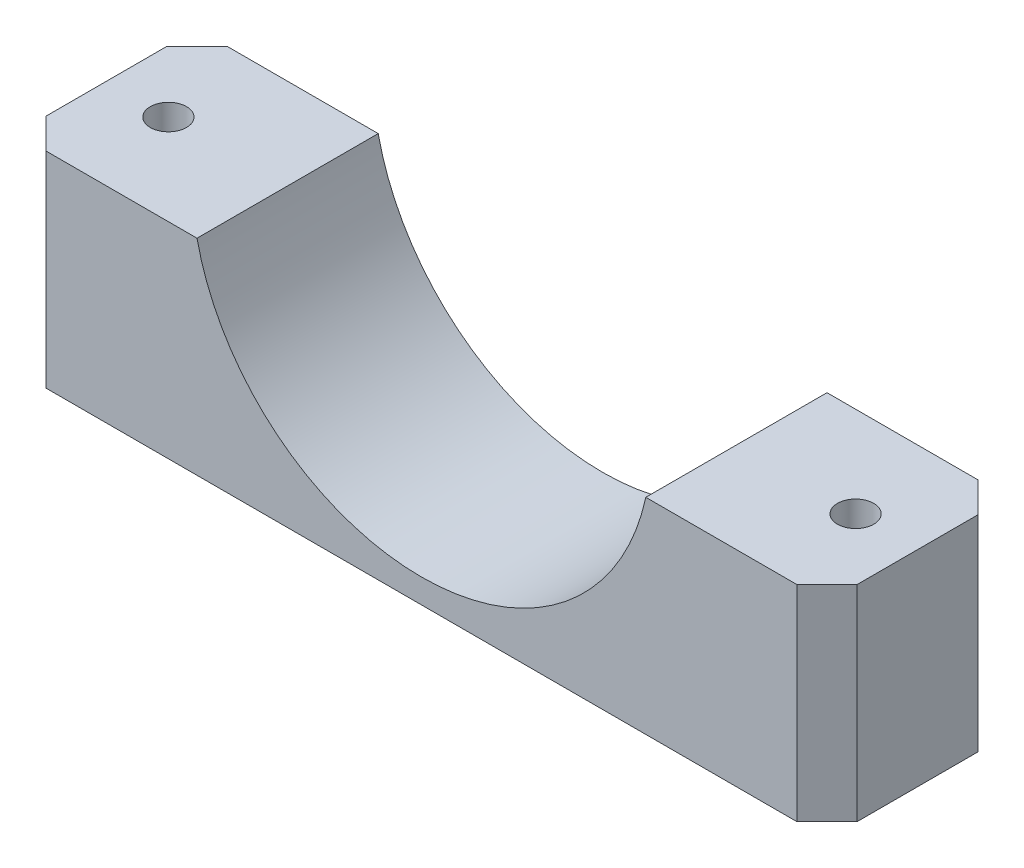
ISO-10303-21;
HEADER;
FILE_DESCRIPTION(('STEP AP214'),'2;1');
FILE_NAME('part.step','',(''),(''),'','','');
FILE_SCHEMA(('AUTOMOTIVE_DESIGN { 1 0 10303 214 1 1 1 1 }'));
ENDSEC;
DATA;
#1=APPLICATION_CONTEXT('core data for automotive mechanical design processes');
#2=APPLICATION_PROTOCOL_DEFINITION('international standard','automotive_design',2000,#1);
#3=PRODUCT_CONTEXT('',#1,'mechanical');
#4=PRODUCT('Part','Part','',(#3));
#5=PRODUCT_RELATED_PRODUCT_CATEGORY('part','',(#4));
#6=PRODUCT_DEFINITION_FORMATION('','',#4);
#7=PRODUCT_DEFINITION_CONTEXT('part definition',#1,'design');
#8=PRODUCT_DEFINITION('design','',#6,#7);
#9=PRODUCT_DEFINITION_SHAPE('','',#8);
#10=(LENGTH_UNIT() NAMED_UNIT(*) SI_UNIT(.MILLI.,.METRE.));
#11=(NAMED_UNIT(*) PLANE_ANGLE_UNIT() SI_UNIT($,.RADIAN.));
#12=(NAMED_UNIT(*) SI_UNIT($,.STERADIAN.) SOLID_ANGLE_UNIT());
#13=UNCERTAINTY_MEASURE_WITH_UNIT(LENGTH_MEASURE(1.E-05),#10,'distance_accuracy_value','');
#14=(GEOMETRIC_REPRESENTATION_CONTEXT(3) GLOBAL_UNCERTAINTY_ASSIGNED_CONTEXT((#13)) GLOBAL_UNIT_ASSIGNED_CONTEXT((#10,
#11,#12)) REPRESENTATION_CONTEXT('',''));
#15=CARTESIAN_POINT('',(0.,0.,0.));
#16=DIRECTION('',(0.,0.,1.));
#17=DIRECTION('',(1.,0.,0.));
#18=AXIS2_PLACEMENT_3D('',#15,#16,#17);
#19=CARTESIAN_POINT('',(33.5741756210067,-21.,15.));
#20=DIRECTION('',(-1.,0.,0.));
#21=DIRECTION('',(0.,0.,1.));
#22=AXIS2_PLACEMENT_3D('',#19,#20,#21);
#23=PLANE('',#22);
#24=DIRECTION('',(0.,0.,-1.));
#25=VECTOR('',#24,1.);
#26=CARTESIAN_POINT('',(33.5741756210067,-21.,15.));
#27=LINE('',#26,#25);
#28=CARTESIAN_POINT('',(33.5741756210067,-21.,12.5));
#29=VERTEX_POINT('',#28);
#30=CARTESIAN_POINT('',(33.5741756210067,-21.,2.50000000000002));
#31=VERTEX_POINT('',#30);
#32=EDGE_CURVE('E160',#29,#31,#27,.T.);
#33=ORIENTED_EDGE('',*,*,#32,.T.);
#34=DIRECTION('',(0.,1.,0.));
#35=VECTOR('',#34,1.);
#36=CARTESIAN_POINT('',(33.5741756210067,-21.,2.50000000000002));
#37=LINE('',#36,#35);
#38=CARTESIAN_POINT('',(33.5741756210067,-3.99999999999999,2.50000000000002));
#39=VERTEX_POINT('',#38);
#40=EDGE_CURVE('E180',#31,#39,#37,.T.);
#41=ORIENTED_EDGE('',*,*,#40,.T.);
#42=DIRECTION('',(0.,0.,-1.));
#43=VECTOR('',#42,1.);
#44=CARTESIAN_POINT('',(33.5741756210067,-3.99999999999999,15.));
#45=LINE('',#44,#43);
#46=CARTESIAN_POINT('',(33.5741756210067,-3.99999999999999,12.5));
#47=VERTEX_POINT('',#46);
#48=EDGE_CURVE('E148',#47,#39,#45,.T.);
#49=ORIENTED_EDGE('',*,*,#48,.F.);
#50=DIRECTION('',(0.,-1.,0.));
#51=VECTOR('',#50,1.);
#52=CARTESIAN_POINT('',(33.5741756210067,-21.,12.5));
#53=LINE('',#52,#51);
#54=EDGE_CURVE('E178',#47,#29,#53,.T.);
#55=ORIENTED_EDGE('',*,*,#54,.T.);
#56=EDGE_LOOP('',(#33,#41,#49,#55));
#57=FACE_BOUND('',#56,.T.);
#58=ADVANCED_FACE('F47',(#57),#23,.F.);
#59=CARTESIAN_POINT('',(33.5741756210067,-3.99999999999999,15.));
#60=DIRECTION('',(0.,-1.,0.));
#61=DIRECTION('',(1.,0.,0.));
#62=AXIS2_PLACEMENT_3D('',#59,#60,#61);
#63=PLANE('',#62);
#64=CARTESIAN_POINT('',(28.4416172615433,-4.,7.50000000000003));
#65=DIRECTION('',(0.,1.,0.));
#66=DIRECTION('',(0.,0.,1.));
#67=AXIS2_PLACEMENT_3D('',#64,#65,#66);
#68=CIRCLE('',#67,1.49999999999999);
#69=CARTESIAN_POINT('',(28.4416172615433,-4.,9.00000000000002));
#70=VERTEX_POINT('',#69);
#71=EDGE_CURVE('E290',#70,#70,#68,.T.);
#72=ORIENTED_EDGE('',*,*,#71,.F.);
#73=EDGE_LOOP('',(#72));
#74=FACE_BOUND('',#73,.T.);
#75=ORIENTED_EDGE('',*,*,#48,.T.);
#76=DIRECTION('',(0.707106781186548,0.,0.707106781186547));
#77=VECTOR('',#76,1.);
#78=CARTESIAN_POINT('',(33.5741756210067,-3.99999999999999,2.50000000000001));
#79=LINE('',#78,#77);
#80=CARTESIAN_POINT('',(31.0741756210067,-4.,0.));
#81=VERTEX_POINT('',#80);
#82=EDGE_CURVE('E185',#39,#81,#79,.F.);
#83=ORIENTED_EDGE('',*,*,#82,.T.);
#84=DIRECTION('',(-1.,0.,0.));
#85=VECTOR('',#84,1.);
#86=CARTESIAN_POINT('',(33.5741756210067,-3.99999999999999,0.));
#87=LINE('',#86,#85);
#88=CARTESIAN_POINT('',(18.5741756210067,-4.,0.));
#89=VERTEX_POINT('',#88);
#90=EDGE_CURVE('E144',#81,#89,#87,.T.);
#91=ORIENTED_EDGE('',*,*,#90,.T.);
#92=DIRECTION('',(0.,0.,-1.));
#93=VECTOR('',#92,1.);
#94=CARTESIAN_POINT('',(18.5741756210067,-4.,15.));
#95=LINE('',#94,#93);
#96=CARTESIAN_POINT('',(18.5741756210067,-4.,15.));
#97=VERTEX_POINT('',#96);
#98=EDGE_CURVE('E140',#97,#89,#95,.T.);
#99=ORIENTED_EDGE('',*,*,#98,.F.);
#100=DIRECTION('',(-1.,0.,0.));
#101=VECTOR('',#100,1.);
#102=CARTESIAN_POINT('',(33.5741756210067,-3.99999999999999,15.));
#103=LINE('',#102,#101);
#104=CARTESIAN_POINT('',(31.0741756210067,-4.,15.));
#105=VERTEX_POINT('',#104);
#106=EDGE_CURVE('E127',#105,#97,#103,.T.);
#107=ORIENTED_EDGE('',*,*,#106,.F.);
#108=DIRECTION('',(0.707106781186548,0.,-0.707106781186548));
#109=VECTOR('',#108,1.);
#110=CARTESIAN_POINT('',(31.0741756210067,-4.,15.));
#111=LINE('',#110,#109);
#112=EDGE_CURVE('E183',#105,#47,#111,.T.);
#113=ORIENTED_EDGE('',*,*,#112,.T.);
#114=EDGE_LOOP('',(#75,#83,#91,#99,#107,#113));
#115=FACE_BOUND('',#114,.T.);
#116=ADVANCED_FACE('F142',(#74,#115),#63,.F.);
#117=CARTESIAN_POINT('',(0.,0.,15.));
#118=DIRECTION('',(0.,0.,-1.));
#119=DIRECTION('',(-1.,0.,0.));
#120=AXIS2_PLACEMENT_3D('',#117,#118,#119);
#121=CYLINDRICAL_SURFACE('',#120,19.);
#122=CARTESIAN_POINT('',(0.,0.,0.));
#123=DIRECTION('',(0.,0.,1.));
#124=DIRECTION('',(1.,0.,0.));
#125=AXIS2_PLACEMENT_3D('',#122,#123,#124);
#126=CIRCLE('',#125,19.);
#127=CARTESIAN_POINT('',(-18.5741756210067,-3.99999999999999,0.));
#128=VERTEX_POINT('',#127);
#129=EDGE_CURVE('E162',#128,#89,#126,.T.);
#130=ORIENTED_EDGE('',*,*,#129,.F.);
#131=DIRECTION('',(0.,0.,-1.));
#132=VECTOR('',#131,1.);
#133=CARTESIAN_POINT('',(-18.5741756210067,-3.99999999999999,15.));
#134=LINE('',#133,#132);
#135=CARTESIAN_POINT('',(-18.5741756210067,-3.99999999999999,15.));
#136=VERTEX_POINT('',#135);
#137=EDGE_CURVE('E149',#136,#128,#134,.T.);
#138=ORIENTED_EDGE('',*,*,#137,.F.);
#139=CARTESIAN_POINT('',(0.,0.,15.));
#140=DIRECTION('',(0.,0.,1.));
#141=DIRECTION('',(1.,0.,0.));
#142=AXIS2_PLACEMENT_3D('',#139,#140,#141);
#143=CIRCLE('',#142,19.);
#144=EDGE_CURVE('E133',#136,#97,#143,.T.);
#145=ORIENTED_EDGE('',*,*,#144,.T.);
#146=ORIENTED_EDGE('',*,*,#98,.T.);
#147=EDGE_LOOP('',(#130,#138,#145,#146));
#148=FACE_BOUND('',#147,.T.);
#149=ADVANCED_FACE('F151',(#148),#121,.F.);
#150=CARTESIAN_POINT('',(-18.5741756210067,-4.,15.));
#151=DIRECTION('',(0.,-1.,0.));
#152=DIRECTION('',(1.,0.,0.));
#153=AXIS2_PLACEMENT_3D('',#150,#151,#152);
#154=PLANE('',#153);
#155=CARTESIAN_POINT('',(-28.4416172615433,-4.00000000000002,7.50000000000003));
#156=DIRECTION('',(0.,1.,0.));
#157=DIRECTION('',(0.,0.,1.));
#158=AXIS2_PLACEMENT_3D('',#155,#156,#157);
#159=CIRCLE('',#158,1.49999999999999);
#160=CARTESIAN_POINT('',(-28.4416172615433,-4.00000000000002,9.00000000000002));
#161=VERTEX_POINT('',#160);
#162=EDGE_CURVE('E287',#161,#161,#159,.T.);
#163=ORIENTED_EDGE('',*,*,#162,.F.);
#164=EDGE_LOOP('',(#163));
#165=FACE_BOUND('',#164,.T.);
#166=DIRECTION('',(-1.,0.,0.));
#167=VECTOR('',#166,1.);
#168=CARTESIAN_POINT('',(-18.5741756210067,-4.,0.));
#169=LINE('',#168,#167);
#170=CARTESIAN_POINT('',(-31.0741756210067,-4.,0.));
#171=VERTEX_POINT('',#170);
#172=EDGE_CURVE('E165',#128,#171,#169,.T.);
#173=ORIENTED_EDGE('',*,*,#172,.T.);
#174=DIRECTION('',(0.707106781186548,0.,-0.707106781186547));
#175=VECTOR('',#174,1.);
#176=CARTESIAN_POINT('',(-33.5741756210067,-4.,2.50000000000002));
#177=LINE('',#176,#175);
#178=CARTESIAN_POINT('',(-33.5741756210067,-4.,2.50000000000002));
#179=VERTEX_POINT('',#178);
#180=EDGE_CURVE('E11',#171,#179,#177,.F.);
#181=ORIENTED_EDGE('',*,*,#180,.T.);
#182=DIRECTION('',(0.,0.,-1.));
#183=VECTOR('',#182,1.);
#184=CARTESIAN_POINT('',(-33.5741756210067,-4.,15.));
#185=LINE('',#184,#183);
#186=CARTESIAN_POINT('',(-33.5741756210067,-4.,12.5));
#187=VERTEX_POINT('',#186);
#188=EDGE_CURVE('E174',#187,#179,#185,.T.);
#189=ORIENTED_EDGE('',*,*,#188,.F.);
#190=DIRECTION('',(0.707106781186548,0.,0.707106781186548));
#191=VECTOR('',#190,1.);
#192=CARTESIAN_POINT('',(-31.0741756210067,-4.,15.));
#193=LINE('',#192,#191);
#194=CARTESIAN_POINT('',(-31.0741756210067,-4.,15.));
#195=VERTEX_POINT('',#194);
#196=EDGE_CURVE('E57',#187,#195,#193,.T.);
#197=ORIENTED_EDGE('',*,*,#196,.T.);
#198=DIRECTION('',(-1.,0.,0.));
#199=VECTOR('',#198,1.);
#200=CARTESIAN_POINT('',(-18.5741756210067,-4.,15.));
#201=LINE('',#200,#199);
#202=EDGE_CURVE('E153',#136,#195,#201,.T.);
#203=ORIENTED_EDGE('',*,*,#202,.F.);
#204=ORIENTED_EDGE('',*,*,#137,.T.);
#205=EDGE_LOOP('',(#173,#181,#189,#197,#203,#204));
#206=FACE_BOUND('',#205,.T.);
#207=ADVANCED_FACE('F208',(#165,#206),#154,.F.);
#208=CARTESIAN_POINT('',(-33.5741756210067,-4.,15.));
#209=DIRECTION('',(1.,0.,0.));
#210=DIRECTION('',(0.,0.,-1.));
#211=AXIS2_PLACEMENT_3D('',#208,#209,#210);
#212=PLANE('',#211);
#213=ORIENTED_EDGE('',*,*,#188,.T.);
#214=DIRECTION('',(0.,-1.,0.));
#215=VECTOR('',#214,1.);
#216=CARTESIAN_POINT('',(-33.5741756210067,-4.,2.50000000000002));
#217=LINE('',#216,#215);
#218=CARTESIAN_POINT('',(-33.5741756210067,-21.,2.50000000000002));
#219=VERTEX_POINT('',#218);
#220=EDGE_CURVE('E204',#179,#219,#217,.T.);
#221=ORIENTED_EDGE('',*,*,#220,.T.);
#222=DIRECTION('',(0.,0.,-1.));
#223=VECTOR('',#222,1.);
#224=CARTESIAN_POINT('',(-33.5741756210067,-21.,15.));
#225=LINE('',#224,#223);
#226=CARTESIAN_POINT('',(-33.5741756210067,-21.,12.5));
#227=VERTEX_POINT('',#226);
#228=EDGE_CURVE('E171',#227,#219,#225,.T.);
#229=ORIENTED_EDGE('',*,*,#228,.F.);
#230=DIRECTION('',(0.,1.,0.));
#231=VECTOR('',#230,1.);
#232=CARTESIAN_POINT('',(-33.5741756210067,-4.,12.5));
#233=LINE('',#232,#231);
#234=EDGE_CURVE('E69',#227,#187,#233,.T.);
#235=ORIENTED_EDGE('',*,*,#234,.T.);
#236=EDGE_LOOP('',(#213,#221,#229,#235));
#237=FACE_BOUND('',#236,.T.);
#238=ADVANCED_FACE('F214',(#237),#212,.F.);
#239=CARTESIAN_POINT('',(-33.5741756210067,-21.,15.));
#240=DIRECTION('',(0.,1.,0.));
#241=DIRECTION('',(0.,0.,1.));
#242=AXIS2_PLACEMENT_3D('',#239,#240,#241);
#243=PLANE('',#242);
#244=CARTESIAN_POINT('',(-28.4416172615433,-21.,7.50000000000003));
#245=DIRECTION('',(0.,1.,0.));
#246=DIRECTION('',(0.,0.,1.));
#247=AXIS2_PLACEMENT_3D('',#244,#245,#246);
#248=CIRCLE('',#247,1.49999999999999);
#249=CARTESIAN_POINT('',(-28.4416172615433,-21.,9.00000000000002));
#250=VERTEX_POINT('',#249);
#251=EDGE_CURVE('E52',#250,#250,#248,.T.);
#252=ORIENTED_EDGE('',*,*,#251,.T.);
#253=EDGE_LOOP('',(#252));
#254=FACE_BOUND('',#253,.T.);
#255=CARTESIAN_POINT('',(28.4416172615433,-21.,7.50000000000003));
#256=DIRECTION('',(0.,1.,0.));
#257=DIRECTION('',(0.,0.,1.));
#258=AXIS2_PLACEMENT_3D('',#255,#256,#257);
#259=CIRCLE('',#258,1.49999999999999);
#260=CARTESIAN_POINT('',(28.4416172615433,-21.,9.00000000000002));
#261=VERTEX_POINT('',#260);
#262=EDGE_CURVE('E163',#261,#261,#259,.T.);
#263=ORIENTED_EDGE('',*,*,#262,.T.);
#264=EDGE_LOOP('',(#263));
#265=FACE_BOUND('',#264,.T.);
#266=DIRECTION('',(1.,0.,0.));
#267=VECTOR('',#266,1.);
#268=CARTESIAN_POINT('',(-33.5741756210067,-21.,0.));
#269=LINE('',#268,#267);
#270=CARTESIAN_POINT('',(-31.0741756210067,-21.,0.));
#271=VERTEX_POINT('',#270);
#272=CARTESIAN_POINT('',(31.0741756210067,-21.,0.));
#273=VERTEX_POINT('',#272);
#274=EDGE_CURVE('E137',#271,#273,#269,.T.);
#275=ORIENTED_EDGE('',*,*,#274,.T.);
#276=DIRECTION('',(-0.707106781186548,0.,-0.707106781186547));
#277=VECTOR('',#276,1.);
#278=CARTESIAN_POINT('',(33.5741756210067,-21.,2.50000000000002));
#279=LINE('',#278,#277);
#280=EDGE_CURVE('E197',#273,#31,#279,.F.);
#281=ORIENTED_EDGE('',*,*,#280,.T.);
#282=ORIENTED_EDGE('',*,*,#32,.F.);
#283=DIRECTION('',(-0.707106781186548,0.,0.707106781186548));
#284=VECTOR('',#283,1.);
#285=CARTESIAN_POINT('',(31.0741756210067,-21.,15.));
#286=LINE('',#285,#284);
#287=CARTESIAN_POINT('',(31.0741756210067,-21.,15.));
#288=VERTEX_POINT('',#287);
#289=EDGE_CURVE('E195',#29,#288,#286,.T.);
#290=ORIENTED_EDGE('',*,*,#289,.T.);
#291=DIRECTION('',(1.,0.,0.));
#292=VECTOR('',#291,1.);
#293=CARTESIAN_POINT('',(-33.5741756210067,-21.,15.));
#294=LINE('',#293,#292);
#295=CARTESIAN_POINT('',(-31.0741756210067,-21.,15.));
#296=VERTEX_POINT('',#295);
#297=EDGE_CURVE('E155',#296,#288,#294,.T.);
#298=ORIENTED_EDGE('',*,*,#297,.F.);
#299=DIRECTION('',(-0.707106781186548,0.,-0.707106781186548));
#300=VECTOR('',#299,1.);
#301=CARTESIAN_POINT('',(-31.0741756210067,-21.,15.));
#302=LINE('',#301,#300);
#303=EDGE_CURVE('E191',#296,#227,#302,.T.);
#304=ORIENTED_EDGE('',*,*,#303,.T.);
#305=ORIENTED_EDGE('',*,*,#228,.T.);
#306=DIRECTION('',(-0.707106781186548,0.,0.707106781186547));
#307=VECTOR('',#306,1.);
#308=CARTESIAN_POINT('',(-33.5741756210067,-21.,2.50000000000002));
#309=LINE('',#308,#307);
#310=EDGE_CURVE('E193',#219,#271,#309,.F.);
#311=ORIENTED_EDGE('',*,*,#310,.T.);
#312=EDGE_LOOP('',(#275,#281,#282,#290,#298,#304,#305,#311));
#313=FACE_BOUND('',#312,.T.);
#314=ADVANCED_FACE('F213',(#254,#265,#313),#243,.F.);
#315=CARTESIAN_POINT('',(0.,0.,15.));
#316=DIRECTION('',(0.,0.,1.));
#317=DIRECTION('',(1.,0.,0.));
#318=AXIS2_PLACEMENT_3D('',#315,#316,#317);
#319=PLANE('',#318);
#320=ORIENTED_EDGE('',*,*,#297,.T.);
#321=DIRECTION('',(0.,1.,0.));
#322=VECTOR('',#321,1.);
#323=CARTESIAN_POINT('',(31.0741756210067,-3.99999999999999,15.));
#324=LINE('',#323,#322);
#325=EDGE_CURVE('E135',#288,#105,#324,.T.);
#326=ORIENTED_EDGE('',*,*,#325,.T.);
#327=ORIENTED_EDGE('',*,*,#106,.T.);
#328=ORIENTED_EDGE('',*,*,#144,.F.);
#329=ORIENTED_EDGE('',*,*,#202,.T.);
#330=DIRECTION('',(0.,-1.,0.));
#331=VECTOR('',#330,1.);
#332=CARTESIAN_POINT('',(-31.0741756210067,-21.,15.));
#333=LINE('',#332,#331);
#334=EDGE_CURVE('E199',#195,#296,#333,.T.);
#335=ORIENTED_EDGE('',*,*,#334,.T.);
#336=EDGE_LOOP('',(#320,#326,#327,#328,#329,#335));
#337=FACE_BOUND('',#336,.T.);
#338=ADVANCED_FACE('F130',(#337),#319,.T.);
#339=CARTESIAN_POINT('',(0.,0.,0.));
#340=DIRECTION('',(0.,0.,1.));
#341=DIRECTION('',(1.,0.,0.));
#342=AXIS2_PLACEMENT_3D('',#339,#340,#341);
#343=PLANE('',#342);
#344=ORIENTED_EDGE('',*,*,#90,.F.);
#345=DIRECTION('',(0.,-1.,0.));
#346=VECTOR('',#345,1.);
#347=CARTESIAN_POINT('',(31.0741756210067,0.,0.));
#348=LINE('',#347,#346);
#349=EDGE_CURVE('E189',#81,#273,#348,.T.);
#350=ORIENTED_EDGE('',*,*,#349,.T.);
#351=ORIENTED_EDGE('',*,*,#274,.F.);
#352=DIRECTION('',(0.,1.,0.));
#353=VECTOR('',#352,1.);
#354=CARTESIAN_POINT('',(-31.0741756210067,0.,0.));
#355=LINE('',#354,#353);
#356=EDGE_CURVE('E187',#271,#171,#355,.T.);
#357=ORIENTED_EDGE('',*,*,#356,.T.);
#358=ORIENTED_EDGE('',*,*,#172,.F.);
#359=ORIENTED_EDGE('',*,*,#129,.T.);
#360=EDGE_LOOP('',(#344,#350,#351,#357,#358,#359));
#361=FACE_BOUND('',#360,.T.);
#362=ADVANCED_FACE('F222',(#361),#343,.F.);
#363=CARTESIAN_POINT('',(33.5741756210067,-21.,2.50000000000002));
#364=DIRECTION('',(-0.707106781186547,0.,0.707106781186548));
#365=DIRECTION('',(0.,1.,0.));
#366=AXIS2_PLACEMENT_3D('',#363,#364,#365);
#367=PLANE('',#366);
#368=ORIENTED_EDGE('',*,*,#280,.F.);
#369=ORIENTED_EDGE('',*,*,#349,.F.);
#370=ORIENTED_EDGE('',*,*,#82,.F.);
#371=ORIENTED_EDGE('',*,*,#40,.F.);
#372=EDGE_LOOP('',(#368,#369,#370,#371));
#373=FACE_BOUND('',#372,.T.);
#374=ADVANCED_FACE('F226',(#373),#367,.F.);
#375=CARTESIAN_POINT('',(31.0741756210067,0.,15.));
#376=DIRECTION('',(0.707106781186547,0.,0.707106781186547));
#377=DIRECTION('',(0.,-1.,0.));
#378=AXIS2_PLACEMENT_3D('',#375,#376,#377);
#379=PLANE('',#378);
#380=ORIENTED_EDGE('',*,*,#289,.F.);
#381=ORIENTED_EDGE('',*,*,#54,.F.);
#382=ORIENTED_EDGE('',*,*,#112,.F.);
#383=ORIENTED_EDGE('',*,*,#325,.F.);
#384=EDGE_LOOP('',(#380,#381,#382,#383));
#385=FACE_BOUND('',#384,.T.);
#386=ADVANCED_FACE('F234',(#385),#379,.T.);
#387=CARTESIAN_POINT('',(-33.5741756210067,-4.,2.50000000000002));
#388=DIRECTION('',(0.707106781186547,0.,0.707106781186548));
#389=DIRECTION('',(0.,-1.,0.));
#390=AXIS2_PLACEMENT_3D('',#387,#388,#389);
#391=PLANE('',#390);
#392=ORIENTED_EDGE('',*,*,#180,.F.);
#393=ORIENTED_EDGE('',*,*,#356,.F.);
#394=ORIENTED_EDGE('',*,*,#310,.F.);
#395=ORIENTED_EDGE('',*,*,#220,.F.);
#396=EDGE_LOOP('',(#392,#393,#394,#395));
#397=FACE_BOUND('',#396,.T.);
#398=ADVANCED_FACE('F217',(#397),#391,.F.);
#399=CARTESIAN_POINT('',(-31.0741756210067,0.,15.));
#400=DIRECTION('',(-0.707106781186547,0.,0.707106781186547));
#401=DIRECTION('',(0.,1.,0.));
#402=AXIS2_PLACEMENT_3D('',#399,#400,#401);
#403=PLANE('',#402);
#404=ORIENTED_EDGE('',*,*,#196,.F.);
#405=ORIENTED_EDGE('',*,*,#234,.F.);
#406=ORIENTED_EDGE('',*,*,#303,.F.);
#407=ORIENTED_EDGE('',*,*,#334,.F.);
#408=EDGE_LOOP('',(#404,#405,#406,#407));
#409=FACE_BOUND('',#408,.T.);
#410=ADVANCED_FACE('F50',(#409),#403,.T.);
#411=CARTESIAN_POINT('',(28.4416172615433,-4.,7.50000000000003));
#412=DIRECTION('',(0.,1.,0.));
#413=DIRECTION('',(0.,0.,1.));
#414=AXIS2_PLACEMENT_3D('',#411,#412,#413);
#415=CYLINDRICAL_SURFACE('',#414,1.49999999999999);
#416=ORIENTED_EDGE('',*,*,#71,.T.);
#417=EDGE_LOOP('',(#416));
#418=FACE_BOUND('',#417,.T.);
#419=ORIENTED_EDGE('',*,*,#262,.F.);
#420=EDGE_LOOP('',(#419));
#421=FACE_BOUND('',#420,.T.);
#422=ADVANCED_FACE('F275',(#418,#421),#415,.F.);
#423=CARTESIAN_POINT('',(-28.4416172615433,-4.00000000000002,7.50000000000003));
#424=DIRECTION('',(0.,1.,0.));
#425=DIRECTION('',(0.,0.,1.));
#426=AXIS2_PLACEMENT_3D('',#423,#424,#425);
#427=CYLINDRICAL_SURFACE('',#426,1.49999999999999);
#428=ORIENTED_EDGE('',*,*,#162,.T.);
#429=EDGE_LOOP('',(#428));
#430=FACE_BOUND('',#429,.T.);
#431=ORIENTED_EDGE('',*,*,#251,.F.);
#432=EDGE_LOOP('',(#431));
#433=FACE_BOUND('',#432,.T.);
#434=ADVANCED_FACE('F278',(#430,#433),#427,.F.);
#435=CLOSED_SHELL('',(#58,#116,#149,#207,#238,#314,#338,#362,#374,#386,#398,#410,#422,#434));
#436=MANIFOLD_SOLID_BREP('B2',#435);
#437=ADVANCED_BREP_SHAPE_REPRESENTATION('',(#18,#436),#14);
#438=SHAPE_DEFINITION_REPRESENTATION(#9,#437);
ENDSEC;
END-ISO-10303-21;
